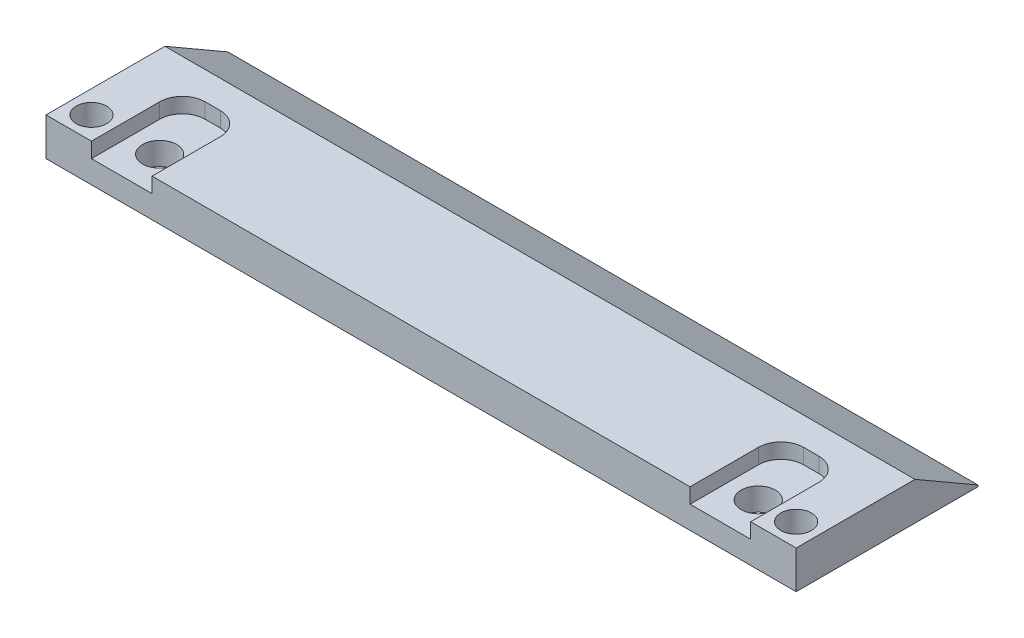
ISO-10303-21;
HEADER;
FILE_DESCRIPTION(('STEP AP214'),'2;1');
FILE_NAME('part.step','',(''),(''),'','','');
FILE_SCHEMA(('AUTOMOTIVE_DESIGN { 1 0 10303 214 1 1 1 1 }'));
ENDSEC;
DATA;
#1=APPLICATION_CONTEXT('core data for automotive mechanical design processes');
#2=APPLICATION_PROTOCOL_DEFINITION('international standard','automotive_design',2000,#1);
#3=PRODUCT_CONTEXT('',#1,'mechanical');
#4=PRODUCT('Part','Part','',(#3));
#5=PRODUCT_RELATED_PRODUCT_CATEGORY('part','',(#4));
#6=PRODUCT_DEFINITION_FORMATION('','',#4);
#7=PRODUCT_DEFINITION_CONTEXT('part definition',#1,'design');
#8=PRODUCT_DEFINITION('design','',#6,#7);
#9=PRODUCT_DEFINITION_SHAPE('','',#8);
#10=(LENGTH_UNIT() NAMED_UNIT(*) SI_UNIT(.MILLI.,.METRE.));
#11=(NAMED_UNIT(*) PLANE_ANGLE_UNIT() SI_UNIT($,.RADIAN.));
#12=(NAMED_UNIT(*) SI_UNIT($,.STERADIAN.) SOLID_ANGLE_UNIT());
#13=UNCERTAINTY_MEASURE_WITH_UNIT(LENGTH_MEASURE(1.E-05),#10,'distance_accuracy_value','');
#14=(GEOMETRIC_REPRESENTATION_CONTEXT(3) GLOBAL_UNCERTAINTY_ASSIGNED_CONTEXT((#13)) GLOBAL_UNIT_ASSIGNED_CONTEXT((#10,
#11,#12)) REPRESENTATION_CONTEXT('',''));
#15=CARTESIAN_POINT('',(0.,0.,0.));
#16=DIRECTION('',(0.,0.,1.));
#17=DIRECTION('',(1.,0.,0.));
#18=AXIS2_PLACEMENT_3D('',#15,#16,#17);
#19=CARTESIAN_POINT('',(39.5,5.,6.99999999999999));
#20=DIRECTION('',(0.,-1.,0.));
#21=DIRECTION('',(0.,0.,-1.));
#22=AXIS2_PLACEMENT_3D('',#19,#20,#21);
#23=CYLINDRICAL_SURFACE('',#22,2.25);
#24=CARTESIAN_POINT('',(39.5,0.,6.99999999999999));
#25=DIRECTION('',(0.,1.,0.));
#26=DIRECTION('',(0.,0.,1.));
#27=AXIS2_PLACEMENT_3D('',#24,#25,#26);
#28=CIRCLE('',#27,2.25);
#29=CARTESIAN_POINT('',(39.5,0.,9.24999999999999));
#30=VERTEX_POINT('',#29);
#31=EDGE_CURVE('E229',#30,#30,#28,.F.);
#32=ORIENTED_EDGE('',*,*,#31,.T.);
#33=EDGE_LOOP('',(#32));
#34=FACE_BOUND('',#33,.T.);
#35=CARTESIAN_POINT('',(39.5,3.,6.99999999999999));
#36=DIRECTION('',(0.,1.,0.));
#37=DIRECTION('',(0.,0.,1.));
#38=AXIS2_PLACEMENT_3D('',#35,#36,#37);
#39=CIRCLE('',#38,2.25);
#40=CARTESIAN_POINT('',(39.5,3.,9.24999999999999));
#41=VERTEX_POINT('',#40);
#42=EDGE_CURVE('E206',#41,#41,#39,.F.);
#43=ORIENTED_EDGE('',*,*,#42,.F.);
#44=EDGE_LOOP('',(#43));
#45=FACE_BOUND('',#44,.T.);
#46=ADVANCED_FACE('F42',(#34,#45),#23,.F.);
#47=CARTESIAN_POINT('',(-39.5,5.,7.));
#48=DIRECTION('',(0.,-1.,0.));
#49=DIRECTION('',(0.,0.,-1.));
#50=AXIS2_PLACEMENT_3D('',#47,#48,#49);
#51=CYLINDRICAL_SURFACE('',#50,2.25);
#52=CARTESIAN_POINT('',(-39.5,0.,7.));
#53=DIRECTION('',(0.,1.,0.));
#54=DIRECTION('',(0.,0.,1.));
#55=AXIS2_PLACEMENT_3D('',#52,#53,#54);
#56=CIRCLE('',#55,2.25);
#57=CARTESIAN_POINT('',(-39.5,0.,9.25));
#58=VERTEX_POINT('',#57);
#59=EDGE_CURVE('E195',#58,#58,#56,.T.);
#60=ORIENTED_EDGE('',*,*,#59,.F.);
#61=EDGE_LOOP('',(#60));
#62=FACE_BOUND('',#61,.T.);
#63=CARTESIAN_POINT('',(-39.5,3.,7.));
#64=DIRECTION('',(0.,1.,0.));
#65=DIRECTION('',(0.,0.,1.));
#66=AXIS2_PLACEMENT_3D('',#63,#64,#65);
#67=CIRCLE('',#66,2.25);
#68=CARTESIAN_POINT('',(-39.5,3.,9.25));
#69=VERTEX_POINT('',#68);
#70=EDGE_CURVE('E203',#69,#69,#67,.T.);
#71=ORIENTED_EDGE('',*,*,#70,.T.);
#72=EDGE_LOOP('',(#71));
#73=FACE_BOUND('',#72,.T.);
#74=ADVANCED_FACE('F295',(#62,#73),#51,.F.);
#75=CARTESIAN_POINT('',(-49.5,5.,0.));
#76=DIRECTION('',(1.,0.,0.));
#77=DIRECTION('',(0.,0.,-1.));
#78=AXIS2_PLACEMENT_3D('',#75,#76,#77);
#79=PLANE('',#78);
#80=DIRECTION('',(0.,0.,1.));
#81=VECTOR('',#80,1.);
#82=CARTESIAN_POINT('',(-49.5,5.,0.));
#83=LINE('',#82,#81);
#84=CARTESIAN_POINT('',(-49.5,5.,-3.68615612366942));
#85=VERTEX_POINT('',#84);
#86=CARTESIAN_POINT('',(-49.5,5.,12.));
#87=VERTEX_POINT('',#86);
#88=EDGE_CURVE('E174',#85,#87,#83,.T.);
#89=ORIENTED_EDGE('',*,*,#88,.F.);
#90=DIRECTION('',(0.,0.500000000000001,0.866025403784438));
#91=VECTOR('',#90,1.);
#92=CARTESIAN_POINT('',(-49.5,5.34615242270664,-3.08660254037846));
#93=LINE('',#92,#91);
#94=CARTESIAN_POINT('',(-49.5,0.2,-12.));
#95=VERTEX_POINT('',#94);
#96=EDGE_CURVE('E57',#95,#85,#93,.T.);
#97=ORIENTED_EDGE('',*,*,#96,.F.);
#98=DIRECTION('',(0.,-1.,0.));
#99=VECTOR('',#98,1.);
#100=CARTESIAN_POINT('',(-49.5,5.,-12.));
#101=LINE('',#100,#99);
#102=CARTESIAN_POINT('',(-49.5,0.,-12.));
#103=VERTEX_POINT('',#102);
#104=EDGE_CURVE('E171',#95,#103,#101,.T.);
#105=ORIENTED_EDGE('',*,*,#104,.T.);
#106=DIRECTION('',(0.,0.,1.));
#107=VECTOR('',#106,1.);
#108=CARTESIAN_POINT('',(-49.5,0.,0.));
#109=LINE('',#108,#107);
#110=CARTESIAN_POINT('',(-49.5,0.,12.));
#111=VERTEX_POINT('',#110);
#112=EDGE_CURVE('E210',#103,#111,#109,.T.);
#113=ORIENTED_EDGE('',*,*,#112,.T.);
#114=DIRECTION('',(0.,-1.,0.));
#115=VECTOR('',#114,1.);
#116=CARTESIAN_POINT('',(-49.5,5.,12.));
#117=LINE('',#116,#115);
#118=EDGE_CURVE('E51',#87,#111,#117,.T.);
#119=ORIENTED_EDGE('',*,*,#118,.F.);
#120=EDGE_LOOP('',(#89,#97,#105,#113,#119));
#121=FACE_BOUND('',#120,.T.);
#122=ADVANCED_FACE('F44',(#121),#79,.F.);
#123=CARTESIAN_POINT('',(0.,5.,12.));
#124=DIRECTION('',(0.,0.,-1.));
#125=DIRECTION('',(-1.,0.,0.));
#126=AXIS2_PLACEMENT_3D('',#123,#124,#125);
#127=PLANE('',#126);
#128=DIRECTION('',(1.,0.,0.));
#129=VECTOR('',#128,1.);
#130=CARTESIAN_POINT('',(0.,5.,12.));
#131=LINE('',#130,#129);
#132=CARTESIAN_POINT('',(-35.5,5.,12.));
#133=VERTEX_POINT('',#132);
#134=CARTESIAN_POINT('',(35.5,5.,12.));
#135=VERTEX_POINT('',#134);
#136=EDGE_CURVE('E257',#133,#135,#131,.T.);
#137=ORIENTED_EDGE('',*,*,#136,.F.);
#138=DIRECTION('',(0.,1.,0.));
#139=VECTOR('',#138,1.);
#140=CARTESIAN_POINT('',(-35.5,3.,12.));
#141=LINE('',#140,#139);
#142=CARTESIAN_POINT('',(-35.5,3.,12.));
#143=VERTEX_POINT('',#142);
#144=EDGE_CURVE('E207',#143,#133,#141,.T.);
#145=ORIENTED_EDGE('',*,*,#144,.F.);
#146=DIRECTION('',(1.,0.,0.));
#147=VECTOR('',#146,1.);
#148=CARTESIAN_POINT('',(-43.5,3.,12.));
#149=LINE('',#148,#147);
#150=CARTESIAN_POINT('',(-43.5,3.,12.));
#151=VERTEX_POINT('',#150);
#152=EDGE_CURVE('E336',#151,#143,#149,.T.);
#153=ORIENTED_EDGE('',*,*,#152,.F.);
#154=DIRECTION('',(0.,1.,0.));
#155=VECTOR('',#154,1.);
#156=CARTESIAN_POINT('',(-43.5,3.,12.));
#157=LINE('',#156,#155);
#158=CARTESIAN_POINT('',(-43.5,5.,12.));
#159=VERTEX_POINT('',#158);
#160=EDGE_CURVE('E319',#151,#159,#157,.T.);
#161=ORIENTED_EDGE('',*,*,#160,.T.);
#162=EDGE_CURVE('E259',#87,#159,#131,.T.);
#163=ORIENTED_EDGE('',*,*,#162,.F.);
#164=ORIENTED_EDGE('',*,*,#118,.T.);
#165=DIRECTION('',(1.,0.,0.));
#166=VECTOR('',#165,1.);
#167=CARTESIAN_POINT('',(0.,0.,12.));
#168=LINE('',#167,#166);
#169=CARTESIAN_POINT('',(49.5,0.,12.));
#170=VERTEX_POINT('',#169);
#171=EDGE_CURVE('E216',#111,#170,#168,.T.);
#172=ORIENTED_EDGE('',*,*,#171,.T.);
#173=DIRECTION('',(0.,-1.,0.));
#174=VECTOR('',#173,1.);
#175=CARTESIAN_POINT('',(49.5,5.,12.));
#176=LINE('',#175,#174);
#177=CARTESIAN_POINT('',(49.5,5.,12.));
#178=VERTEX_POINT('',#177);
#179=EDGE_CURVE('E188',#178,#170,#176,.T.);
#180=ORIENTED_EDGE('',*,*,#179,.F.);
#181=CARTESIAN_POINT('',(43.5,5.,12.));
#182=VERTEX_POINT('',#181);
#183=EDGE_CURVE('E249',#182,#178,#131,.T.);
#184=ORIENTED_EDGE('',*,*,#183,.F.);
#185=DIRECTION('',(0.,1.,0.));
#186=VECTOR('',#185,1.);
#187=CARTESIAN_POINT('',(43.5,3.,12.));
#188=LINE('',#187,#186);
#189=CARTESIAN_POINT('',(43.5,3.,12.));
#190=VERTEX_POINT('',#189);
#191=EDGE_CURVE('E261',#190,#182,#188,.T.);
#192=ORIENTED_EDGE('',*,*,#191,.F.);
#193=DIRECTION('',(1.,0.,0.));
#194=VECTOR('',#193,1.);
#195=CARTESIAN_POINT('',(43.5,3.,12.));
#196=LINE('',#195,#194);
#197=CARTESIAN_POINT('',(35.5,3.,12.));
#198=VERTEX_POINT('',#197);
#199=EDGE_CURVE('E337',#198,#190,#196,.T.);
#200=ORIENTED_EDGE('',*,*,#199,.F.);
#201=DIRECTION('',(0.,1.,0.));
#202=VECTOR('',#201,1.);
#203=CARTESIAN_POINT('',(35.5,3.,12.));
#204=LINE('',#203,#202);
#205=EDGE_CURVE('E316',#198,#135,#204,.T.);
#206=ORIENTED_EDGE('',*,*,#205,.T.);
#207=EDGE_LOOP('',(#137,#145,#153,#161,#163,#164,#172,#180,#184,#192,#200,#206));
#208=FACE_BOUND('',#207,.T.);
#209=ADVANCED_FACE('F290',(#208),#127,.F.);
#210=CARTESIAN_POINT('',(49.5,5.,0.));
#211=DIRECTION('',(1.,0.,0.));
#212=DIRECTION('',(0.,0.,-1.));
#213=AXIS2_PLACEMENT_3D('',#210,#211,#212);
#214=PLANE('',#213);
#215=DIRECTION('',(0.,-0.500000000000001,-0.866025403784438));
#216=VECTOR('',#215,1.);
#217=CARTESIAN_POINT('',(49.5,6.59615242270665,-0.921539030917359));
#218=LINE('',#217,#216);
#219=CARTESIAN_POINT('',(49.5,5.,-3.68615612366942));
#220=VERTEX_POINT('',#219);
#221=CARTESIAN_POINT('',(49.5,0.2,-12.));
#222=VERTEX_POINT('',#221);
#223=EDGE_CURVE('E162',#220,#222,#218,.T.);
#224=ORIENTED_EDGE('',*,*,#223,.F.);
#225=DIRECTION('',(0.,0.,1.));
#226=VECTOR('',#225,1.);
#227=CARTESIAN_POINT('',(49.5,5.,0.));
#228=LINE('',#227,#226);
#229=EDGE_CURVE('E265',#220,#178,#228,.T.);
#230=ORIENTED_EDGE('',*,*,#229,.T.);
#231=ORIENTED_EDGE('',*,*,#179,.T.);
#232=DIRECTION('',(0.,0.,1.));
#233=VECTOR('',#232,1.);
#234=CARTESIAN_POINT('',(49.5,0.,0.));
#235=LINE('',#234,#233);
#236=CARTESIAN_POINT('',(49.5,0.,-12.));
#237=VERTEX_POINT('',#236);
#238=EDGE_CURVE('E221',#237,#170,#235,.T.);
#239=ORIENTED_EDGE('',*,*,#238,.F.);
#240=DIRECTION('',(0.,-1.,0.));
#241=VECTOR('',#240,1.);
#242=CARTESIAN_POINT('',(49.5,5.,-12.));
#243=LINE('',#242,#241);
#244=EDGE_CURVE('E182',#222,#237,#243,.T.);
#245=ORIENTED_EDGE('',*,*,#244,.F.);
#246=EDGE_LOOP('',(#224,#230,#231,#239,#245));
#247=FACE_BOUND('',#246,.T.);
#248=ADVANCED_FACE('F283',(#247),#214,.T.);
#249=CARTESIAN_POINT('',(46.5,5.,8.99999999999999));
#250=DIRECTION('',(0.,-1.,0.));
#251=DIRECTION('',(0.,0.,-1.));
#252=AXIS2_PLACEMENT_3D('',#249,#250,#251);
#253=CYLINDRICAL_SURFACE('',#252,2.01750494210506);
#254=CARTESIAN_POINT('',(46.5,5.,8.99999999999999));
#255=DIRECTION('',(0.,1.,0.));
#256=DIRECTION('',(0.,0.,1.));
#257=AXIS2_PLACEMENT_3D('',#254,#255,#256);
#258=CIRCLE('',#257,2.01750494210506);
#259=CARTESIAN_POINT('',(46.5,5.,11.017504942105));
#260=VERTEX_POINT('',#259);
#261=EDGE_CURVE('E183',#260,#260,#258,.F.);
#262=ORIENTED_EDGE('',*,*,#261,.F.);
#263=EDGE_LOOP('',(#262));
#264=FACE_BOUND('',#263,.T.);
#265=CARTESIAN_POINT('',(46.5,0.,8.99999999999999));
#266=DIRECTION('',(0.,1.,0.));
#267=DIRECTION('',(0.,0.,1.));
#268=AXIS2_PLACEMENT_3D('',#265,#266,#267);
#269=CIRCLE('',#268,2.01750494210506);
#270=CARTESIAN_POINT('',(46.5,0.,11.017504942105));
#271=VERTEX_POINT('',#270);
#272=EDGE_CURVE('E236',#271,#271,#269,.F.);
#273=ORIENTED_EDGE('',*,*,#272,.T.);
#274=EDGE_LOOP('',(#273));
#275=FACE_BOUND('',#274,.T.);
#276=ADVANCED_FACE('F281',(#264,#275),#253,.F.);
#277=CARTESIAN_POINT('',(-46.5,5.,9.));
#278=DIRECTION('',(0.,-1.,0.));
#279=DIRECTION('',(0.,0.,-1.));
#280=AXIS2_PLACEMENT_3D('',#277,#278,#279);
#281=CYLINDRICAL_SURFACE('',#280,2.01750494210506);
#282=CARTESIAN_POINT('',(-46.5,5.,9.));
#283=DIRECTION('',(0.,1.,0.));
#284=DIRECTION('',(0.,0.,1.));
#285=AXIS2_PLACEMENT_3D('',#282,#283,#284);
#286=CIRCLE('',#285,2.01750494210506);
#287=CARTESIAN_POINT('',(-46.5,5.,11.0175049421051));
#288=VERTEX_POINT('',#287);
#289=EDGE_CURVE('E192',#288,#288,#286,.T.);
#290=ORIENTED_EDGE('',*,*,#289,.T.);
#291=EDGE_LOOP('',(#290));
#292=FACE_BOUND('',#291,.T.);
#293=CARTESIAN_POINT('',(-46.5,0.,9.));
#294=DIRECTION('',(0.,1.,0.));
#295=DIRECTION('',(0.,0.,1.));
#296=AXIS2_PLACEMENT_3D('',#293,#294,#295);
#297=CIRCLE('',#296,2.01750494210506);
#298=CARTESIAN_POINT('',(-46.5,0.,11.0175049421051));
#299=VERTEX_POINT('',#298);
#300=EDGE_CURVE('E233',#299,#299,#297,.T.);
#301=ORIENTED_EDGE('',*,*,#300,.F.);
#302=EDGE_LOOP('',(#301));
#303=FACE_BOUND('',#302,.T.);
#304=ADVANCED_FACE('F271',(#292,#303),#281,.F.);
#305=CARTESIAN_POINT('',(0.,5.,-12.));
#306=DIRECTION('',(0.,0.,-1.));
#307=DIRECTION('',(-1.,0.,0.));
#308=AXIS2_PLACEMENT_3D('',#305,#306,#307);
#309=PLANE('',#308);
#310=DIRECTION('',(-1.,0.,0.));
#311=VECTOR('',#310,1.);
#312=CARTESIAN_POINT('',(91.5,0.2,-12.));
#313=LINE('',#312,#311);
#314=EDGE_CURVE('E159',#222,#95,#313,.T.);
#315=ORIENTED_EDGE('',*,*,#314,.F.);
#316=ORIENTED_EDGE('',*,*,#244,.T.);
#317=DIRECTION('',(1.,0.,0.));
#318=VECTOR('',#317,1.);
#319=CARTESIAN_POINT('',(0.,0.,-12.));
#320=LINE('',#319,#318);
#321=EDGE_CURVE('E180',#103,#237,#320,.T.);
#322=ORIENTED_EDGE('',*,*,#321,.F.);
#323=ORIENTED_EDGE('',*,*,#104,.F.);
#324=EDGE_LOOP('',(#315,#316,#322,#323));
#325=FACE_BOUND('',#324,.T.);
#326=ADVANCED_FACE('F178',(#325),#309,.T.);
#327=CARTESIAN_POINT('',(0.,5.,0.));
#328=DIRECTION('',(0.,1.,0.));
#329=DIRECTION('',(0.,0.,1.));
#330=AXIS2_PLACEMENT_3D('',#327,#328,#329);
#331=PLANE('',#330);
#332=DIRECTION('',(1.,0.,0.));
#333=VECTOR('',#332,1.);
#334=CARTESIAN_POINT('',(0.,5.,-3.68615612366942));
#335=LINE('',#334,#333);
#336=EDGE_CURVE('E11',#85,#220,#335,.T.);
#337=ORIENTED_EDGE('',*,*,#336,.F.);
#338=ORIENTED_EDGE('',*,*,#88,.T.);
#339=ORIENTED_EDGE('',*,*,#162,.T.);
#340=DIRECTION('',(0.,0.,1.));
#341=VECTOR('',#340,1.);
#342=CARTESIAN_POINT('',(-43.5,5.,3.));
#343=LINE('',#342,#341);
#344=CARTESIAN_POINT('',(-43.5,5.,3.));
#345=VERTEX_POINT('',#344);
#346=EDGE_CURVE('E414',#345,#159,#343,.T.);
#347=ORIENTED_EDGE('',*,*,#346,.F.);
#348=CARTESIAN_POINT('',(-40.5,5.,3.));
#349=DIRECTION('',(0.,1.,0.));
#350=DIRECTION('',(0.,0.,1.));
#351=AXIS2_PLACEMENT_3D('',#348,#349,#350);
#352=CIRCLE('',#351,3.);
#353=CARTESIAN_POINT('',(-40.5,5.,0.));
#354=VERTEX_POINT('',#353);
#355=EDGE_CURVE('E440',#354,#345,#352,.T.);
#356=ORIENTED_EDGE('',*,*,#355,.F.);
#357=DIRECTION('',(-1.,0.,0.));
#358=VECTOR('',#357,1.);
#359=CARTESIAN_POINT('',(-40.5,5.,0.));
#360=LINE('',#359,#358);
#361=CARTESIAN_POINT('',(-38.5,5.,0.));
#362=VERTEX_POINT('',#361);
#363=EDGE_CURVE('E437',#362,#354,#360,.T.);
#364=ORIENTED_EDGE('',*,*,#363,.F.);
#365=CARTESIAN_POINT('',(-38.5,5.,3.));
#366=DIRECTION('',(0.,1.,0.));
#367=DIRECTION('',(0.,0.,-1.));
#368=AXIS2_PLACEMENT_3D('',#365,#366,#367);
#369=CIRCLE('',#368,3.);
#370=CARTESIAN_POINT('',(-35.5,5.,3.));
#371=VERTEX_POINT('',#370);
#372=EDGE_CURVE('E433',#371,#362,#369,.T.);
#373=ORIENTED_EDGE('',*,*,#372,.F.);
#374=DIRECTION('',(0.,0.,-1.));
#375=VECTOR('',#374,1.);
#376=CARTESIAN_POINT('',(-35.5,5.,3.));
#377=LINE('',#376,#375);
#378=EDGE_CURVE('E65',#133,#371,#377,.T.);
#379=ORIENTED_EDGE('',*,*,#378,.F.);
#380=ORIENTED_EDGE('',*,*,#136,.T.);
#381=DIRECTION('',(0.,0.,1.));
#382=VECTOR('',#381,1.);
#383=CARTESIAN_POINT('',(35.5,5.,2.99999999999999));
#384=LINE('',#383,#382);
#385=CARTESIAN_POINT('',(35.5,5.,2.99999999999999));
#386=VERTEX_POINT('',#385);
#387=EDGE_CURVE('E342',#386,#135,#384,.T.);
#388=ORIENTED_EDGE('',*,*,#387,.F.);
#389=CARTESIAN_POINT('',(38.5,5.,2.99999999999999));
#390=DIRECTION('',(0.,1.,0.));
#391=DIRECTION('',(0.,0.,1.));
#392=AXIS2_PLACEMENT_3D('',#389,#390,#391);
#393=CIRCLE('',#392,3.);
#394=CARTESIAN_POINT('',(38.5,5.,0.));
#395=VERTEX_POINT('',#394);
#396=EDGE_CURVE('E374',#395,#386,#393,.T.);
#397=ORIENTED_EDGE('',*,*,#396,.F.);
#398=DIRECTION('',(-1.,0.,0.));
#399=VECTOR('',#398,1.);
#400=CARTESIAN_POINT('',(40.5,5.,0.));
#401=LINE('',#400,#399);
#402=CARTESIAN_POINT('',(40.5,5.,0.));
#403=VERTEX_POINT('',#402);
#404=EDGE_CURVE('E370',#403,#395,#401,.T.);
#405=ORIENTED_EDGE('',*,*,#404,.F.);
#406=CARTESIAN_POINT('',(40.5,5.,2.99999999999999));
#407=DIRECTION('',(0.,1.,0.));
#408=DIRECTION('',(0.,0.,-1.));
#409=AXIS2_PLACEMENT_3D('',#406,#407,#408);
#410=CIRCLE('',#409,3.);
#411=CARTESIAN_POINT('',(43.5,5.,2.99999999999999));
#412=VERTEX_POINT('',#411);
#413=EDGE_CURVE('E366',#412,#403,#410,.T.);
#414=ORIENTED_EDGE('',*,*,#413,.F.);
#415=DIRECTION('',(0.,0.,-1.));
#416=VECTOR('',#415,1.);
#417=CARTESIAN_POINT('',(43.5,5.,2.99999999999999));
#418=LINE('',#417,#416);
#419=EDGE_CURVE('E362',#182,#412,#418,.T.);
#420=ORIENTED_EDGE('',*,*,#419,.F.);
#421=ORIENTED_EDGE('',*,*,#183,.T.);
#422=ORIENTED_EDGE('',*,*,#229,.F.);
#423=EDGE_LOOP('',(#337,#338,#339,#347,#356,#364,#373,#379,#380,#388,#397,#405,#414,#420,#421,#422));
#424=FACE_BOUND('',#423,.T.);
#425=ORIENTED_EDGE('',*,*,#289,.F.);
#426=EDGE_LOOP('',(#425));
#427=FACE_BOUND('',#426,.T.);
#428=ORIENTED_EDGE('',*,*,#261,.T.);
#429=EDGE_LOOP('',(#428));
#430=FACE_BOUND('',#429,.T.);
#431=ADVANCED_FACE('F274',(#424,#427,#430),#331,.T.);
#432=CARTESIAN_POINT('',(0.,0.,0.));
#433=DIRECTION('',(0.,1.,0.));
#434=DIRECTION('',(0.,0.,1.));
#435=AXIS2_PLACEMENT_3D('',#432,#433,#434);
#436=PLANE('',#435);
#437=ORIENTED_EDGE('',*,*,#112,.F.);
#438=ORIENTED_EDGE('',*,*,#321,.T.);
#439=ORIENTED_EDGE('',*,*,#238,.T.);
#440=ORIENTED_EDGE('',*,*,#171,.F.);
#441=EDGE_LOOP('',(#437,#438,#439,#440));
#442=FACE_BOUND('',#441,.T.);
#443=ORIENTED_EDGE('',*,*,#31,.F.);
#444=EDGE_LOOP('',(#443));
#445=FACE_BOUND('',#444,.T.);
#446=ORIENTED_EDGE('',*,*,#300,.T.);
#447=EDGE_LOOP('',(#446));
#448=FACE_BOUND('',#447,.T.);
#449=ORIENTED_EDGE('',*,*,#272,.F.);
#450=EDGE_LOOP('',(#449));
#451=FACE_BOUND('',#450,.T.);
#452=ORIENTED_EDGE('',*,*,#59,.T.);
#453=EDGE_LOOP('',(#452));
#454=FACE_BOUND('',#453,.T.);
#455=ADVANCED_FACE('F277',(#442,#445,#448,#451,#454),#436,.F.);
#456=CARTESIAN_POINT('',(38.5,3.,2.99999999999999));
#457=DIRECTION('',(0.,1.,0.));
#458=DIRECTION('',(0.,0.,1.));
#459=AXIS2_PLACEMENT_3D('',#456,#457,#458);
#460=PLANE('',#459);
#461=ORIENTED_EDGE('',*,*,#199,.T.);
#462=DIRECTION('',(0.,0.,-1.));
#463=VECTOR('',#462,1.);
#464=CARTESIAN_POINT('',(43.5,3.,2.99999999999999));
#465=LINE('',#464,#463);
#466=CARTESIAN_POINT('',(43.5,3.,2.99999999999999));
#467=VERTEX_POINT('',#466);
#468=EDGE_CURVE('E341',#190,#467,#465,.T.);
#469=ORIENTED_EDGE('',*,*,#468,.T.);
#470=CARTESIAN_POINT('',(40.5,3.,2.99999999999999));
#471=DIRECTION('',(0.,1.,0.));
#472=DIRECTION('',(0.,0.,-1.));
#473=AXIS2_PLACEMENT_3D('',#470,#471,#472);
#474=CIRCLE('',#473,3.);
#475=CARTESIAN_POINT('',(40.5,3.,0.));
#476=VERTEX_POINT('',#475);
#477=EDGE_CURVE('E346',#467,#476,#474,.T.);
#478=ORIENTED_EDGE('',*,*,#477,.T.);
#479=DIRECTION('',(-1.,0.,0.));
#480=VECTOR('',#479,1.);
#481=CARTESIAN_POINT('',(40.5,3.,0.));
#482=LINE('',#481,#480);
#483=CARTESIAN_POINT('',(38.5,3.,0.));
#484=VERTEX_POINT('',#483);
#485=EDGE_CURVE('E350',#476,#484,#482,.T.);
#486=ORIENTED_EDGE('',*,*,#485,.T.);
#487=CARTESIAN_POINT('',(38.5,3.,2.99999999999999));
#488=DIRECTION('',(0.,1.,0.));
#489=DIRECTION('',(0.,0.,1.));
#490=AXIS2_PLACEMENT_3D('',#487,#488,#489);
#491=CIRCLE('',#490,3.);
#492=CARTESIAN_POINT('',(35.5,3.,2.99999999999999));
#493=VERTEX_POINT('',#492);
#494=EDGE_CURVE('E354',#484,#493,#491,.T.);
#495=ORIENTED_EDGE('',*,*,#494,.T.);
#496=DIRECTION('',(0.,0.,1.));
#497=VECTOR('',#496,1.);
#498=CARTESIAN_POINT('',(35.5,3.,2.99999999999999));
#499=LINE('',#498,#497);
#500=EDGE_CURVE('E358',#493,#198,#499,.T.);
#501=ORIENTED_EDGE('',*,*,#500,.T.);
#502=EDGE_LOOP('',(#461,#469,#478,#486,#495,#501));
#503=FACE_BOUND('',#502,.T.);
#504=ORIENTED_EDGE('',*,*,#42,.T.);
#505=EDGE_LOOP('',(#504));
#506=FACE_BOUND('',#505,.T.);
#507=ADVANCED_FACE('F474',(#503,#506),#460,.T.);
#508=CARTESIAN_POINT('',(35.5,3.,2.99999999999999));
#509=DIRECTION('',(-1.,0.,0.));
#510=DIRECTION('',(0.,0.,1.));
#511=AXIS2_PLACEMENT_3D('',#508,#509,#510);
#512=PLANE('',#511);
#513=ORIENTED_EDGE('',*,*,#387,.T.);
#514=ORIENTED_EDGE('',*,*,#205,.F.);
#515=ORIENTED_EDGE('',*,*,#500,.F.);
#516=DIRECTION('',(0.,1.,0.));
#517=VECTOR('',#516,1.);
#518=CARTESIAN_POINT('',(35.5,3.,2.99999999999999));
#519=LINE('',#518,#517);
#520=EDGE_CURVE('E382',#493,#386,#519,.T.);
#521=ORIENTED_EDGE('',*,*,#520,.T.);
#522=EDGE_LOOP('',(#513,#514,#515,#521));
#523=FACE_BOUND('',#522,.T.);
#524=ADVANCED_FACE('F477',(#523),#512,.F.);
#525=CARTESIAN_POINT('',(38.5,3.,2.99999999999999));
#526=DIRECTION('',(0.,1.,0.));
#527=DIRECTION('',(0.,0.,1.));
#528=AXIS2_PLACEMENT_3D('',#525,#526,#527);
#529=CYLINDRICAL_SURFACE('',#528,3.);
#530=ORIENTED_EDGE('',*,*,#396,.T.);
#531=ORIENTED_EDGE('',*,*,#520,.F.);
#532=ORIENTED_EDGE('',*,*,#494,.F.);
#533=DIRECTION('',(0.,1.,0.));
#534=VECTOR('',#533,1.);
#535=CARTESIAN_POINT('',(38.5,3.,0.));
#536=LINE('',#535,#534);
#537=EDGE_CURVE('E384',#484,#395,#536,.T.);
#538=ORIENTED_EDGE('',*,*,#537,.T.);
#539=EDGE_LOOP('',(#530,#531,#532,#538));
#540=FACE_BOUND('',#539,.T.);
#541=ADVANCED_FACE('F481',(#540),#529,.F.);
#542=CARTESIAN_POINT('',(40.5,3.,0.));
#543=DIRECTION('',(0.,0.,-1.));
#544=DIRECTION('',(-1.,0.,0.));
#545=AXIS2_PLACEMENT_3D('',#542,#543,#544);
#546=PLANE('',#545);
#547=ORIENTED_EDGE('',*,*,#404,.T.);
#548=ORIENTED_EDGE('',*,*,#537,.F.);
#549=ORIENTED_EDGE('',*,*,#485,.F.);
#550=DIRECTION('',(0.,1.,0.));
#551=VECTOR('',#550,1.);
#552=CARTESIAN_POINT('',(40.5,3.,0.));
#553=LINE('',#552,#551);
#554=EDGE_CURVE('E387',#476,#403,#553,.T.);
#555=ORIENTED_EDGE('',*,*,#554,.T.);
#556=EDGE_LOOP('',(#547,#548,#549,#555));
#557=FACE_BOUND('',#556,.T.);
#558=ADVANCED_FACE('F485',(#557),#546,.F.);
#559=CARTESIAN_POINT('',(40.5,3.,2.99999999999999));
#560=DIRECTION('',(0.,1.,0.));
#561=DIRECTION('',(0.,0.,1.));
#562=AXIS2_PLACEMENT_3D('',#559,#560,#561);
#563=CYLINDRICAL_SURFACE('',#562,3.);
#564=ORIENTED_EDGE('',*,*,#413,.T.);
#565=ORIENTED_EDGE('',*,*,#554,.F.);
#566=ORIENTED_EDGE('',*,*,#477,.F.);
#567=DIRECTION('',(0.,1.,0.));
#568=VECTOR('',#567,1.);
#569=CARTESIAN_POINT('',(43.5,3.,2.99999999999999));
#570=LINE('',#569,#568);
#571=EDGE_CURVE('E389',#467,#412,#570,.T.);
#572=ORIENTED_EDGE('',*,*,#571,.T.);
#573=EDGE_LOOP('',(#564,#565,#566,#572));
#574=FACE_BOUND('',#573,.T.);
#575=ADVANCED_FACE('F489',(#574),#563,.F.);
#576=CARTESIAN_POINT('',(43.5,3.,2.99999999999999));
#577=DIRECTION('',(1.,0.,0.));
#578=DIRECTION('',(0.,0.,-1.));
#579=AXIS2_PLACEMENT_3D('',#576,#577,#578);
#580=PLANE('',#579);
#581=ORIENTED_EDGE('',*,*,#419,.T.);
#582=ORIENTED_EDGE('',*,*,#571,.F.);
#583=ORIENTED_EDGE('',*,*,#468,.F.);
#584=ORIENTED_EDGE('',*,*,#191,.T.);
#585=EDGE_LOOP('',(#581,#582,#583,#584));
#586=FACE_BOUND('',#585,.T.);
#587=ADVANCED_FACE('F398',(#586),#580,.F.);
#588=CARTESIAN_POINT('',(-35.5,3.,3.));
#589=DIRECTION('',(1.,0.,0.));
#590=DIRECTION('',(0.,0.,-1.));
#591=AXIS2_PLACEMENT_3D('',#588,#589,#590);
#592=PLANE('',#591);
#593=ORIENTED_EDGE('',*,*,#378,.T.);
#594=DIRECTION('',(0.,1.,0.));
#595=VECTOR('',#594,1.);
#596=CARTESIAN_POINT('',(-35.5,3.,3.));
#597=LINE('',#596,#595);
#598=CARTESIAN_POINT('',(-35.5,3.,3.));
#599=VERTEX_POINT('',#598);
#600=EDGE_CURVE('E333',#599,#371,#597,.T.);
#601=ORIENTED_EDGE('',*,*,#600,.F.);
#602=DIRECTION('',(0.,0.,-1.));
#603=VECTOR('',#602,1.);
#604=CARTESIAN_POINT('',(-35.5,3.,3.));
#605=LINE('',#604,#603);
#606=EDGE_CURVE('E409',#143,#599,#605,.T.);
#607=ORIENTED_EDGE('',*,*,#606,.F.);
#608=ORIENTED_EDGE('',*,*,#144,.T.);
#609=EDGE_LOOP('',(#593,#601,#607,#608));
#610=FACE_BOUND('',#609,.T.);
#611=ADVANCED_FACE('F443',(#610),#592,.F.);
#612=CARTESIAN_POINT('',(-43.5,3.,3.));
#613=DIRECTION('',(-1.,0.,0.));
#614=DIRECTION('',(0.,0.,1.));
#615=AXIS2_PLACEMENT_3D('',#612,#613,#614);
#616=PLANE('',#615);
#617=ORIENTED_EDGE('',*,*,#346,.T.);
#618=ORIENTED_EDGE('',*,*,#160,.F.);
#619=DIRECTION('',(0.,0.,1.));
#620=VECTOR('',#619,1.);
#621=CARTESIAN_POINT('',(-43.5,3.,3.));
#622=LINE('',#621,#620);
#623=CARTESIAN_POINT('',(-43.5,3.,3.));
#624=VERTEX_POINT('',#623);
#625=EDGE_CURVE('E425',#624,#151,#622,.T.);
#626=ORIENTED_EDGE('',*,*,#625,.F.);
#627=DIRECTION('',(0.,1.,0.));
#628=VECTOR('',#627,1.);
#629=CARTESIAN_POINT('',(-43.5,3.,3.));
#630=LINE('',#629,#628);
#631=EDGE_CURVE('E318',#624,#345,#630,.T.);
#632=ORIENTED_EDGE('',*,*,#631,.T.);
#633=EDGE_LOOP('',(#617,#618,#626,#632));
#634=FACE_BOUND('',#633,.T.);
#635=ADVANCED_FACE('F454',(#634),#616,.F.);
#636=CARTESIAN_POINT('',(-40.5,3.,3.));
#637=DIRECTION('',(0.,1.,0.));
#638=DIRECTION('',(0.,0.,1.));
#639=AXIS2_PLACEMENT_3D('',#636,#637,#638);
#640=CYLINDRICAL_SURFACE('',#639,3.);
#641=ORIENTED_EDGE('',*,*,#355,.T.);
#642=ORIENTED_EDGE('',*,*,#631,.F.);
#643=CARTESIAN_POINT('',(-40.5,3.,3.));
#644=DIRECTION('',(0.,1.,0.));
#645=DIRECTION('',(0.,0.,1.));
#646=AXIS2_PLACEMENT_3D('',#643,#644,#645);
#647=CIRCLE('',#646,3.);
#648=CARTESIAN_POINT('',(-40.5,3.,0.));
#649=VERTEX_POINT('',#648);
#650=EDGE_CURVE('E421',#649,#624,#647,.T.);
#651=ORIENTED_EDGE('',*,*,#650,.F.);
#652=DIRECTION('',(0.,1.,0.));
#653=VECTOR('',#652,1.);
#654=CARTESIAN_POINT('',(-40.5,3.,0.));
#655=LINE('',#654,#653);
#656=EDGE_CURVE('E320',#649,#354,#655,.T.);
#657=ORIENTED_EDGE('',*,*,#656,.T.);
#658=EDGE_LOOP('',(#641,#642,#651,#657));
#659=FACE_BOUND('',#658,.T.);
#660=ADVANCED_FACE('F456',(#659),#640,.F.);
#661=CARTESIAN_POINT('',(-40.5,3.,0.));
#662=DIRECTION('',(0.,0.,-1.));
#663=DIRECTION('',(-1.,0.,0.));
#664=AXIS2_PLACEMENT_3D('',#661,#662,#663);
#665=PLANE('',#664);
#666=ORIENTED_EDGE('',*,*,#363,.T.);
#667=ORIENTED_EDGE('',*,*,#656,.F.);
#668=DIRECTION('',(-1.,0.,0.));
#669=VECTOR('',#668,1.);
#670=CARTESIAN_POINT('',(-40.5,3.,0.));
#671=LINE('',#670,#669);
#672=CARTESIAN_POINT('',(-38.5,3.,0.));
#673=VERTEX_POINT('',#672);
#674=EDGE_CURVE('E418',#673,#649,#671,.T.);
#675=ORIENTED_EDGE('',*,*,#674,.F.);
#676=DIRECTION('',(0.,1.,0.));
#677=VECTOR('',#676,1.);
#678=CARTESIAN_POINT('',(-38.5,3.,0.));
#679=LINE('',#678,#677);
#680=EDGE_CURVE('E328',#673,#362,#679,.T.);
#681=ORIENTED_EDGE('',*,*,#680,.T.);
#682=EDGE_LOOP('',(#666,#667,#675,#681));
#683=FACE_BOUND('',#682,.T.);
#684=ADVANCED_FACE('F462',(#683),#665,.F.);
#685=CARTESIAN_POINT('',(-38.5,3.,3.));
#686=DIRECTION('',(0.,1.,0.));
#687=DIRECTION('',(0.,0.,1.));
#688=AXIS2_PLACEMENT_3D('',#685,#686,#687);
#689=CYLINDRICAL_SURFACE('',#688,3.);
#690=ORIENTED_EDGE('',*,*,#372,.T.);
#691=ORIENTED_EDGE('',*,*,#680,.F.);
#692=CARTESIAN_POINT('',(-38.5,3.,3.));
#693=DIRECTION('',(0.,1.,0.));
#694=DIRECTION('',(0.,0.,-1.));
#695=AXIS2_PLACEMENT_3D('',#692,#693,#694);
#696=CIRCLE('',#695,3.);
#697=EDGE_CURVE('E413',#599,#673,#696,.T.);
#698=ORIENTED_EDGE('',*,*,#697,.F.);
#699=ORIENTED_EDGE('',*,*,#600,.T.);
#700=EDGE_LOOP('',(#690,#691,#698,#699));
#701=FACE_BOUND('',#700,.T.);
#702=ADVANCED_FACE('F448',(#701),#689,.F.);
#703=CARTESIAN_POINT('',(-40.5,3.,3.));
#704=DIRECTION('',(0.,1.,0.));
#705=DIRECTION('',(0.,0.,1.));
#706=AXIS2_PLACEMENT_3D('',#703,#704,#705);
#707=PLANE('',#706);
#708=ORIENTED_EDGE('',*,*,#70,.F.);
#709=EDGE_LOOP('',(#708));
#710=FACE_BOUND('',#709,.T.);
#711=ORIENTED_EDGE('',*,*,#606,.T.);
#712=ORIENTED_EDGE('',*,*,#697,.T.);
#713=ORIENTED_EDGE('',*,*,#674,.T.);
#714=ORIENTED_EDGE('',*,*,#650,.T.);
#715=ORIENTED_EDGE('',*,*,#625,.T.);
#716=ORIENTED_EDGE('',*,*,#152,.T.);
#717=EDGE_LOOP('',(#711,#712,#713,#714,#715,#716));
#718=FACE_BOUND('',#717,.T.);
#719=ADVANCED_FACE('F452',(#710,#718),#707,.T.);
#720=CARTESIAN_POINT('',(91.5,5.34615242270664,-3.08660254037846));
#721=DIRECTION('',(0.,-0.866025403784438,0.500000000000001));
#722=DIRECTION('',(0.,-0.500000000000001,-0.866025403784438));
#723=AXIS2_PLACEMENT_3D('',#720,#721,#722);
#724=PLANE('',#723);
#725=ORIENTED_EDGE('',*,*,#223,.T.);
#726=ORIENTED_EDGE('',*,*,#314,.T.);
#727=ORIENTED_EDGE('',*,*,#96,.T.);
#728=ORIENTED_EDGE('',*,*,#336,.T.);
#729=EDGE_LOOP('',(#725,#726,#727,#728));
#730=FACE_BOUND('',#729,.T.);
#731=ADVANCED_FACE('F160',(#730),#724,.F.);
#732=CLOSED_SHELL('',(#46,#74,#122,#209,#248,#276,#304,#326,#431,#455,#507,#524,#541,#558,#575,
#587,#611,#635,#660,#684,#702,#719,#731));
#733=MANIFOLD_SOLID_BREP('B2',#732);
#734=ADVANCED_BREP_SHAPE_REPRESENTATION('',(#18,#733),#14);
#735=SHAPE_DEFINITION_REPRESENTATION(#9,#734);
ENDSEC;
END-ISO-10303-21;
